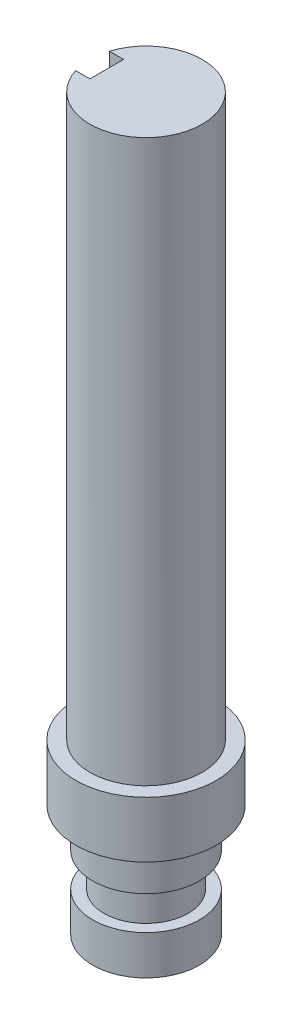
ISO-10303-21;
HEADER;
FILE_DESCRIPTION(('STEP AP214'),'2;1');
FILE_NAME('part.step','',(''),(''),'','','');
FILE_SCHEMA(('AUTOMOTIVE_DESIGN { 1 0 10303 214 1 1 1 1 }'));
ENDSEC;
DATA;
#1=APPLICATION_CONTEXT('core data for automotive mechanical design processes');
#2=APPLICATION_PROTOCOL_DEFINITION('international standard','automotive_design',2000,#1);
#3=PRODUCT_CONTEXT('',#1,'mechanical');
#4=PRODUCT('Part','Part','',(#3));
#5=PRODUCT_RELATED_PRODUCT_CATEGORY('part','',(#4));
#6=PRODUCT_DEFINITION_FORMATION('','',#4);
#7=PRODUCT_DEFINITION_CONTEXT('part definition',#1,'design');
#8=PRODUCT_DEFINITION('design','',#6,#7);
#9=PRODUCT_DEFINITION_SHAPE('','',#8);
#10=(LENGTH_UNIT() NAMED_UNIT(*) SI_UNIT(.MILLI.,.METRE.));
#11=(NAMED_UNIT(*) PLANE_ANGLE_UNIT() SI_UNIT($,.RADIAN.));
#12=(NAMED_UNIT(*) SI_UNIT($,.STERADIAN.) SOLID_ANGLE_UNIT());
#13=UNCERTAINTY_MEASURE_WITH_UNIT(LENGTH_MEASURE(1.E-05),#10,'distance_accuracy_value','');
#14=(GEOMETRIC_REPRESENTATION_CONTEXT(3) GLOBAL_UNCERTAINTY_ASSIGNED_CONTEXT((#13)) GLOBAL_UNIT_ASSIGNED_CONTEXT((#10,
#11,#12)) REPRESENTATION_CONTEXT('',''));
#15=CARTESIAN_POINT('',(0.,0.,0.));
#16=DIRECTION('',(0.,0.,1.));
#17=DIRECTION('',(1.,0.,0.));
#18=AXIS2_PLACEMENT_3D('',#15,#16,#17);
#19=CARTESIAN_POINT('',(0.,50.,0.));
#20=DIRECTION('',(0.,-1.,0.));
#21=DIRECTION('',(0.,0.,-1.));
#22=AXIS2_PLACEMENT_3D('',#19,#20,#21);
#23=CYLINDRICAL_SURFACE('',#22,10.);
#24=CARTESIAN_POINT('',(0.,30.,0.));
#25=DIRECTION('',(0.,1.,0.));
#26=DIRECTION('',(0.,0.,1.));
#27=AXIS2_PLACEMENT_3D('',#24,#25,#26);
#28=CIRCLE('',#27,10.);
#29=CARTESIAN_POINT('',(-9.53939201416945,30.,-3.));
#30=VERTEX_POINT('',#29);
#31=CARTESIAN_POINT('',(-9.53939201416945,30.,3.));
#32=VERTEX_POINT('',#31);
#33=EDGE_CURVE('E11',#30,#32,#28,.T.);
#34=ORIENTED_EDGE('',*,*,#33,.F.);
#35=DIRECTION('',(0.,-1.,0.));
#36=VECTOR('',#35,1.);
#37=CARTESIAN_POINT('',(-9.53939201416945,50.,-3.));
#38=LINE('',#37,#36);
#39=CARTESIAN_POINT('',(-9.53939201416945,50.,-3.));
#40=VERTEX_POINT('',#39);
#41=EDGE_CURVE('E68',#30,#40,#38,.F.);
#42=ORIENTED_EDGE('',*,*,#41,.T.);
#43=CARTESIAN_POINT('',(0.,50.,0.));
#44=DIRECTION('',(0.,1.,0.));
#45=DIRECTION('',(0.,0.,1.));
#46=AXIS2_PLACEMENT_3D('',#43,#44,#45);
#47=CIRCLE('',#46,10.);
#48=CARTESIAN_POINT('',(-9.53939201416945,50.,3.));
#49=VERTEX_POINT('',#48);
#50=EDGE_CURVE('E147',#49,#40,#47,.T.);
#51=ORIENTED_EDGE('',*,*,#50,.F.);
#52=DIRECTION('',(0.,-1.,0.));
#53=VECTOR('',#52,1.);
#54=CARTESIAN_POINT('',(-9.53939201416945,50.,3.));
#55=LINE('',#54,#53);
#56=EDGE_CURVE('E60',#49,#32,#55,.T.);
#57=ORIENTED_EDGE('',*,*,#56,.T.);
#58=EDGE_LOOP('',(#34,#42,#51,#57));
#59=FACE_BOUND('',#58,.T.);
#60=CARTESIAN_POINT('',(0.,-50.,0.));
#61=DIRECTION('',(0.,1.,0.));
#62=DIRECTION('',(0.,0.,1.));
#63=AXIS2_PLACEMENT_3D('',#60,#61,#62);
#64=CIRCLE('',#63,10.);
#65=CARTESIAN_POINT('',(0.,-50.,10.));
#66=VERTEX_POINT('',#65);
#67=EDGE_CURVE('E152',#66,#66,#64,.T.);
#68=ORIENTED_EDGE('',*,*,#67,.T.);
#69=EDGE_LOOP('',(#68));
#70=FACE_BOUND('',#69,.T.);
#71=ADVANCED_FACE('F45',(#59,#70),#23,.T.);
#72=CARTESIAN_POINT('',(0.,50.,0.));
#73=DIRECTION('',(0.,1.,0.));
#74=DIRECTION('',(0.,0.,1.));
#75=AXIS2_PLACEMENT_3D('',#72,#73,#74);
#76=PLANE('',#75);
#77=DIRECTION('',(-1.,0.,0.));
#78=VECTOR('',#77,1.);
#79=CARTESIAN_POINT('',(-7.,50.,-3.));
#80=LINE('',#79,#78);
#81=CARTESIAN_POINT('',(-7.,50.,-3.));
#82=VERTEX_POINT('',#81);
#83=EDGE_CURVE('E93',#82,#40,#80,.T.);
#84=ORIENTED_EDGE('',*,*,#83,.F.);
#85=DIRECTION('',(0.,0.,-1.));
#86=VECTOR('',#85,1.);
#87=CARTESIAN_POINT('',(-7.,50.,3.));
#88=LINE('',#87,#86);
#89=CARTESIAN_POINT('',(-7.,50.,3.));
#90=VERTEX_POINT('',#89);
#91=EDGE_CURVE('E111',#90,#82,#88,.T.);
#92=ORIENTED_EDGE('',*,*,#91,.F.);
#93=DIRECTION('',(1.,0.,0.));
#94=VECTOR('',#93,1.);
#95=CARTESIAN_POINT('',(0.,50.,3.));
#96=LINE('',#95,#94);
#97=EDGE_CURVE('E53',#49,#90,#96,.T.);
#98=ORIENTED_EDGE('',*,*,#97,.F.);
#99=ORIENTED_EDGE('',*,*,#50,.T.);
#100=EDGE_LOOP('',(#84,#92,#98,#99));
#101=FACE_BOUND('',#100,.T.);
#102=ADVANCED_FACE('F175',(#101),#76,.T.);
#103=CARTESIAN_POINT('',(0.,-60.,0.));
#104=DIRECTION('',(0.,1.,0.));
#105=DIRECTION('',(0.,0.,1.));
#106=AXIS2_PLACEMENT_3D('',#103,#104,#105);
#107=CYLINDRICAL_SURFACE('',#106,12.5);
#108=CARTESIAN_POINT('',(0.,-60.,0.));
#109=DIRECTION('',(0.,-1.,0.));
#110=DIRECTION('',(0.,0.,-1.));
#111=AXIS2_PLACEMENT_3D('',#108,#109,#110);
#112=CIRCLE('',#111,12.5);
#113=CARTESIAN_POINT('',(0.,-60.,-12.5));
#114=VERTEX_POINT('',#113);
#115=EDGE_CURVE('E148',#114,#114,#112,.T.);
#116=ORIENTED_EDGE('',*,*,#115,.F.);
#117=EDGE_LOOP('',(#116));
#118=FACE_BOUND('',#117,.T.);
#119=CARTESIAN_POINT('',(0.,-50.,0.));
#120=DIRECTION('',(0.,-1.,0.));
#121=DIRECTION('',(0.,0.,-1.));
#122=AXIS2_PLACEMENT_3D('',#119,#120,#121);
#123=CIRCLE('',#122,12.5);
#124=CARTESIAN_POINT('',(0.,-50.,-12.5));
#125=VERTEX_POINT('',#124);
#126=EDGE_CURVE('E143',#125,#125,#123,.T.);
#127=ORIENTED_EDGE('',*,*,#126,.T.);
#128=EDGE_LOOP('',(#127));
#129=FACE_BOUND('',#128,.T.);
#130=ADVANCED_FACE('F173',(#118,#129),#107,.T.);
#131=CARTESIAN_POINT('',(0.,-60.,0.));
#132=DIRECTION('',(0.,-1.,0.));
#133=DIRECTION('',(0.,0.,-1.));
#134=AXIS2_PLACEMENT_3D('',#131,#132,#133);
#135=PLANE('',#134);
#136=CARTESIAN_POINT('',(0.,-60.,0.));
#137=DIRECTION('',(0.,-1.,0.));
#138=DIRECTION('',(0.,0.,-1.));
#139=AXIS2_PLACEMENT_3D('',#136,#137,#138);
#140=CIRCLE('',#139,9.5);
#141=CARTESIAN_POINT('',(0.,-60.,-9.5));
#142=VERTEX_POINT('',#141);
#143=EDGE_CURVE('E139',#142,#142,#140,.T.);
#144=ORIENTED_EDGE('',*,*,#143,.F.);
#145=EDGE_LOOP('',(#144));
#146=FACE_BOUND('',#145,.T.);
#147=ORIENTED_EDGE('',*,*,#115,.T.);
#148=EDGE_LOOP('',(#147));
#149=FACE_BOUND('',#148,.T.);
#150=ADVANCED_FACE('F169',(#146,#149),#135,.T.);
#151=CARTESIAN_POINT('',(0.,-50.,0.));
#152=DIRECTION('',(0.,-1.,0.));
#153=DIRECTION('',(0.,0.,-1.));
#154=AXIS2_PLACEMENT_3D('',#151,#152,#153);
#155=PLANE('',#154);
#156=ORIENTED_EDGE('',*,*,#67,.F.);
#157=EDGE_LOOP('',(#156));
#158=FACE_BOUND('',#157,.T.);
#159=ORIENTED_EDGE('',*,*,#126,.F.);
#160=EDGE_LOOP('',(#159));
#161=FACE_BOUND('',#160,.T.);
#162=ADVANCED_FACE('F165',(#158,#161),#155,.F.);
#163=CARTESIAN_POINT('',(0.,-67.,0.));
#164=DIRECTION('',(0.,1.,0.));
#165=DIRECTION('',(0.,0.,1.));
#166=AXIS2_PLACEMENT_3D('',#163,#164,#165);
#167=CYLINDRICAL_SURFACE('',#166,9.5);
#168=CARTESIAN_POINT('',(0.,-67.,0.));
#169=DIRECTION('',(0.,-1.,0.));
#170=DIRECTION('',(0.,0.,-1.));
#171=AXIS2_PLACEMENT_3D('',#168,#169,#170);
#172=CIRCLE('',#171,9.5);
#173=CARTESIAN_POINT('',(0.,-67.,-9.5));
#174=VERTEX_POINT('',#173);
#175=EDGE_CURVE('E134',#174,#174,#172,.T.);
#176=ORIENTED_EDGE('',*,*,#175,.F.);
#177=EDGE_LOOP('',(#176));
#178=FACE_BOUND('',#177,.T.);
#179=ORIENTED_EDGE('',*,*,#143,.T.);
#180=EDGE_LOOP('',(#179));
#181=FACE_BOUND('',#180,.T.);
#182=ADVANCED_FACE('F168',(#178,#181),#167,.T.);
#183=CARTESIAN_POINT('',(0.,-67.,0.));
#184=DIRECTION('',(0.,-1.,0.));
#185=DIRECTION('',(0.,0.,-1.));
#186=AXIS2_PLACEMENT_3D('',#183,#184,#185);
#187=PLANE('',#186);
#188=CARTESIAN_POINT('',(0.,-67.,0.));
#189=DIRECTION('',(0.,-1.,0.));
#190=DIRECTION('',(0.,0.,-1.));
#191=AXIS2_PLACEMENT_3D('',#188,#189,#190);
#192=CIRCLE('',#191,7.5);
#193=CARTESIAN_POINT('',(0.,-67.,-7.5));
#194=VERTEX_POINT('',#193);
#195=EDGE_CURVE('E135',#194,#194,#192,.T.);
#196=ORIENTED_EDGE('',*,*,#195,.F.);
#197=EDGE_LOOP('',(#196));
#198=FACE_BOUND('',#197,.T.);
#199=ORIENTED_EDGE('',*,*,#175,.T.);
#200=EDGE_LOOP('',(#199));
#201=FACE_BOUND('',#200,.T.);
#202=ADVANCED_FACE('F219',(#198,#201),#187,.T.);
#203=CARTESIAN_POINT('',(0.,-73.,0.));
#204=DIRECTION('',(0.,1.,0.));
#205=DIRECTION('',(0.,0.,1.));
#206=AXIS2_PLACEMENT_3D('',#203,#204,#205);
#207=CYLINDRICAL_SURFACE('',#206,7.5);
#208=CARTESIAN_POINT('',(0.,-73.,0.));
#209=DIRECTION('',(0.,-1.,0.));
#210=DIRECTION('',(0.,0.,-1.));
#211=AXIS2_PLACEMENT_3D('',#208,#209,#210);
#212=CIRCLE('',#211,7.5);
#213=CARTESIAN_POINT('',(0.,-73.,-7.5));
#214=VERTEX_POINT('',#213);
#215=EDGE_CURVE('E127',#214,#214,#212,.T.);
#216=ORIENTED_EDGE('',*,*,#215,.F.);
#217=EDGE_LOOP('',(#216));
#218=FACE_BOUND('',#217,.T.);
#219=ORIENTED_EDGE('',*,*,#195,.T.);
#220=EDGE_LOOP('',(#219));
#221=FACE_BOUND('',#220,.T.);
#222=ADVANCED_FACE('F215',(#218,#221),#207,.T.);
#223=CARTESIAN_POINT('',(0.,-80.,0.));
#224=DIRECTION('',(0.,1.,0.));
#225=DIRECTION('',(0.,0.,1.));
#226=AXIS2_PLACEMENT_3D('',#223,#224,#225);
#227=CYLINDRICAL_SURFACE('',#226,9.5);
#228=CARTESIAN_POINT('',(0.,-80.,0.));
#229=DIRECTION('',(0.,-1.,0.));
#230=DIRECTION('',(0.,0.,-1.));
#231=AXIS2_PLACEMENT_3D('',#228,#229,#230);
#232=CIRCLE('',#231,9.5);
#233=CARTESIAN_POINT('',(0.,-80.,-9.5));
#234=VERTEX_POINT('',#233);
#235=EDGE_CURVE('E123',#234,#234,#232,.T.);
#236=ORIENTED_EDGE('',*,*,#235,.F.);
#237=EDGE_LOOP('',(#236));
#238=FACE_BOUND('',#237,.T.);
#239=CARTESIAN_POINT('',(0.,-73.,0.));
#240=DIRECTION('',(0.,-1.,0.));
#241=DIRECTION('',(0.,0.,-1.));
#242=AXIS2_PLACEMENT_3D('',#239,#240,#241);
#243=CIRCLE('',#242,9.5);
#244=CARTESIAN_POINT('',(0.,-73.,-9.5));
#245=VERTEX_POINT('',#244);
#246=EDGE_CURVE('E122',#245,#245,#243,.T.);
#247=ORIENTED_EDGE('',*,*,#246,.T.);
#248=EDGE_LOOP('',(#247));
#249=FACE_BOUND('',#248,.T.);
#250=ADVANCED_FACE('F209',(#238,#249),#227,.T.);
#251=CARTESIAN_POINT('',(0.,-80.,0.));
#252=DIRECTION('',(0.,-1.,0.));
#253=DIRECTION('',(0.,0.,-1.));
#254=AXIS2_PLACEMENT_3D('',#251,#252,#253);
#255=PLANE('',#254);
#256=ORIENTED_EDGE('',*,*,#235,.T.);
#257=EDGE_LOOP('',(#256));
#258=FACE_BOUND('',#257,.T.);
#259=ADVANCED_FACE('F206',(#258),#255,.T.);
#260=CARTESIAN_POINT('',(0.,-73.,0.));
#261=DIRECTION('',(0.,-1.,0.));
#262=DIRECTION('',(0.,0.,-1.));
#263=AXIS2_PLACEMENT_3D('',#260,#261,#262);
#264=PLANE('',#263);
#265=ORIENTED_EDGE('',*,*,#215,.T.);
#266=EDGE_LOOP('',(#265));
#267=FACE_BOUND('',#266,.T.);
#268=ORIENTED_EDGE('',*,*,#246,.F.);
#269=EDGE_LOOP('',(#268));
#270=FACE_BOUND('',#269,.T.);
#271=ADVANCED_FACE('F201',(#267,#270),#264,.F.);
#272=CARTESIAN_POINT('',(0.,30.,0.));
#273=DIRECTION('',(0.,1.,0.));
#274=DIRECTION('',(0.,0.,1.));
#275=AXIS2_PLACEMENT_3D('',#272,#273,#274);
#276=PLANE('',#275);
#277=ORIENTED_EDGE('',*,*,#33,.T.);
#278=DIRECTION('',(1.,0.,0.));
#279=VECTOR('',#278,1.);
#280=CARTESIAN_POINT('',(-7.,30.,3.));
#281=LINE('',#280,#279);
#282=CARTESIAN_POINT('',(-7.,30.,3.));
#283=VERTEX_POINT('',#282);
#284=EDGE_CURVE('E86',#32,#283,#281,.T.);
#285=ORIENTED_EDGE('',*,*,#284,.T.);
#286=DIRECTION('',(0.,0.,-1.));
#287=VECTOR('',#286,1.);
#288=CARTESIAN_POINT('',(-7.,30.,3.));
#289=LINE('',#288,#287);
#290=CARTESIAN_POINT('',(-7.,30.,-3.));
#291=VERTEX_POINT('',#290);
#292=EDGE_CURVE('E90',#283,#291,#289,.T.);
#293=ORIENTED_EDGE('',*,*,#292,.T.);
#294=DIRECTION('',(-1.,0.,0.));
#295=VECTOR('',#294,1.);
#296=CARTESIAN_POINT('',(-7.,30.,-3.));
#297=LINE('',#296,#295);
#298=EDGE_CURVE('E103',#291,#30,#297,.T.);
#299=ORIENTED_EDGE('',*,*,#298,.T.);
#300=EDGE_LOOP('',(#277,#285,#293,#299));
#301=FACE_BOUND('',#300,.T.);
#302=ADVANCED_FACE('F88',(#301),#276,.T.);
#303=CARTESIAN_POINT('',(-7.,30.,-3.));
#304=DIRECTION('',(0.,0.,-1.));
#305=DIRECTION('',(-1.,0.,0.));
#306=AXIS2_PLACEMENT_3D('',#303,#304,#305);
#307=PLANE('',#306);
#308=ORIENTED_EDGE('',*,*,#298,.F.);
#309=DIRECTION('',(0.,1.,0.));
#310=VECTOR('',#309,1.);
#311=CARTESIAN_POINT('',(-7.,30.,-3.));
#312=LINE('',#311,#310);
#313=EDGE_CURVE('E102',#291,#82,#312,.T.);
#314=ORIENTED_EDGE('',*,*,#313,.T.);
#315=ORIENTED_EDGE('',*,*,#83,.T.);
#316=ORIENTED_EDGE('',*,*,#41,.F.);
#317=EDGE_LOOP('',(#308,#314,#315,#316));
#318=FACE_BOUND('',#317,.T.);
#319=ADVANCED_FACE('F193',(#318),#307,.F.);
#320=CARTESIAN_POINT('',(-7.,30.,3.));
#321=DIRECTION('',(0.,0.,1.));
#322=DIRECTION('',(1.,0.,0.));
#323=AXIS2_PLACEMENT_3D('',#320,#321,#322);
#324=PLANE('',#323);
#325=ORIENTED_EDGE('',*,*,#97,.T.);
#326=DIRECTION('',(0.,1.,0.));
#327=VECTOR('',#326,1.);
#328=CARTESIAN_POINT('',(-7.,30.,3.));
#329=LINE('',#328,#327);
#330=EDGE_CURVE('E96',#283,#90,#329,.T.);
#331=ORIENTED_EDGE('',*,*,#330,.F.);
#332=ORIENTED_EDGE('',*,*,#284,.F.);
#333=ORIENTED_EDGE('',*,*,#56,.F.);
#334=EDGE_LOOP('',(#325,#331,#332,#333));
#335=FACE_BOUND('',#334,.T.);
#336=ADVANCED_FACE('F97',(#335),#324,.F.);
#337=CARTESIAN_POINT('',(-7.,30.,3.));
#338=DIRECTION('',(1.,0.,0.));
#339=DIRECTION('',(0.,0.,-1.));
#340=AXIS2_PLACEMENT_3D('',#337,#338,#339);
#341=PLANE('',#340);
#342=ORIENTED_EDGE('',*,*,#91,.T.);
#343=ORIENTED_EDGE('',*,*,#313,.F.);
#344=ORIENTED_EDGE('',*,*,#292,.F.);
#345=ORIENTED_EDGE('',*,*,#330,.T.);
#346=EDGE_LOOP('',(#342,#343,#344,#345));
#347=FACE_BOUND('',#346,.T.);
#348=ADVANCED_FACE('F105',(#347),#341,.F.);
#349=CLOSED_SHELL('',(#71,#102,#130,#150,#162,#182,#202,#222,#250,#259,#271,#302,#319,#336,#348));
#350=MANIFOLD_SOLID_BREP('B2',#349);
#351=ADVANCED_BREP_SHAPE_REPRESENTATION('',(#18,#350),#14);
#352=SHAPE_DEFINITION_REPRESENTATION(#9,#351);
ENDSEC;
END-ISO-10303-21;
